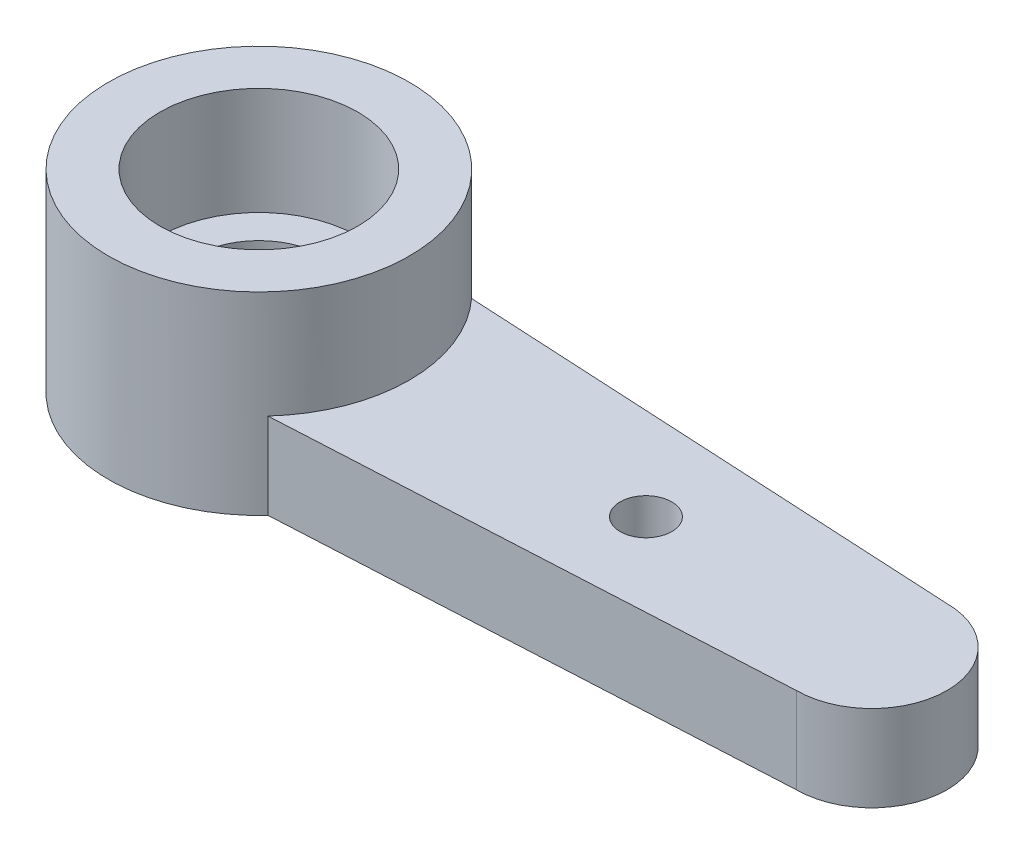
ISO-10303-21;
HEADER;
FILE_DESCRIPTION(('STEP AP214'),'2;1');
FILE_NAME('part.step','',(''),(''),'','','');
FILE_SCHEMA(('AUTOMOTIVE_DESIGN { 1 0 10303 214 1 1 1 1 }'));
ENDSEC;
DATA;
#1=APPLICATION_CONTEXT('core data for automotive mechanical design processes');
#2=APPLICATION_PROTOCOL_DEFINITION('international standard','automotive_design',2000,#1);
#3=PRODUCT_CONTEXT('',#1,'mechanical');
#4=PRODUCT('Part','Part','',(#3));
#5=PRODUCT_RELATED_PRODUCT_CATEGORY('part','',(#4));
#6=PRODUCT_DEFINITION_FORMATION('','',#4);
#7=PRODUCT_DEFINITION_CONTEXT('part definition',#1,'design');
#8=PRODUCT_DEFINITION('design','',#6,#7);
#9=PRODUCT_DEFINITION_SHAPE('','',#8);
#10=(LENGTH_UNIT() NAMED_UNIT(*) SI_UNIT(.MILLI.,.METRE.));
#11=(NAMED_UNIT(*) PLANE_ANGLE_UNIT() SI_UNIT($,.RADIAN.));
#12=(NAMED_UNIT(*) SI_UNIT($,.STERADIAN.) SOLID_ANGLE_UNIT());
#13=UNCERTAINTY_MEASURE_WITH_UNIT(LENGTH_MEASURE(1.E-05),#10,'distance_accuracy_value','');
#14=(GEOMETRIC_REPRESENTATION_CONTEXT(3) GLOBAL_UNCERTAINTY_ASSIGNED_CONTEXT((#13)) GLOBAL_UNIT_ASSIGNED_CONTEXT((#10,
#11,#12)) REPRESENTATION_CONTEXT('',''));
#15=CARTESIAN_POINT('',(0.,0.,0.));
#16=DIRECTION('',(0.,0.,1.));
#17=DIRECTION('',(1.,0.,0.));
#18=AXIS2_PLACEMENT_3D('',#15,#16,#17);
#19=CARTESIAN_POINT('',(0.,2.5,0.));
#20=DIRECTION('',(0.,-1.,0.));
#21=DIRECTION('',(0.,0.,-1.));
#22=AXIS2_PLACEMENT_3D('',#19,#20,#21);
#23=CYLINDRICAL_SURFACE('',#22,2.3);
#24=CARTESIAN_POINT('',(0.,-2.,0.));
#25=DIRECTION('',(0.,1.,0.));
#26=DIRECTION('',(0.,0.,1.));
#27=AXIS2_PLACEMENT_3D('',#24,#25,#26);
#28=CIRCLE('',#27,2.3);
#29=CARTESIAN_POINT('',(0.,-2.,2.3));
#30=VERTEX_POINT('',#29);
#31=EDGE_CURVE('E107',#30,#30,#28,.T.);
#32=ORIENTED_EDGE('',*,*,#31,.F.);
#33=EDGE_LOOP('',(#32));
#34=FACE_BOUND('',#33,.T.);
#35=CARTESIAN_POINT('',(0.,-1.,0.));
#36=DIRECTION('',(0.,1.,0.));
#37=DIRECTION('',(0.,0.,1.));
#38=AXIS2_PLACEMENT_3D('',#35,#36,#37);
#39=CIRCLE('',#38,2.3);
#40=CARTESIAN_POINT('',(0.,-1.,2.3));
#41=VERTEX_POINT('',#40);
#42=EDGE_CURVE('E103',#41,#41,#39,.T.);
#43=ORIENTED_EDGE('',*,*,#42,.T.);
#44=EDGE_LOOP('',(#43));
#45=FACE_BOUND('',#44,.T.);
#46=ADVANCED_FACE('F33',(#34,#45),#23,.F.);
#47=CARTESIAN_POINT('',(0.,0.,0.));
#48=DIRECTION('',(0.,1.,0.));
#49=DIRECTION('',(0.,0.,1.));
#50=AXIS2_PLACEMENT_3D('',#47,#48,#49);
#51=CIRCLE('',#50,2.3);
#52=CARTESIAN_POINT('',(0.,0.,2.3));
#53=VERTEX_POINT('',#52);
#54=EDGE_CURVE('E11',#53,#53,#51,.T.);
#55=ORIENTED_EDGE('',*,*,#54,.F.);
#56=EDGE_LOOP('',(#55));
#57=FACE_BOUND('',#56,.T.);
#58=CARTESIAN_POINT('',(0.,2.5,0.));
#59=DIRECTION('',(0.,1.,0.));
#60=DIRECTION('',(0.,0.,1.));
#61=AXIS2_PLACEMENT_3D('',#58,#59,#60);
#62=CIRCLE('',#61,2.3);
#63=CARTESIAN_POINT('',(0.,2.5,2.3));
#64=VERTEX_POINT('',#63);
#65=EDGE_CURVE('E112',#64,#64,#62,.T.);
#66=ORIENTED_EDGE('',*,*,#65,.T.);
#67=EDGE_LOOP('',(#66));
#68=FACE_BOUND('',#67,.T.);
#69=ADVANCED_FACE('F35',(#57,#68),#23,.F.);
#70=CARTESIAN_POINT('',(0.,2.5,0.));
#71=DIRECTION('',(0.,-1.,0.));
#72=DIRECTION('',(0.,0.,-1.));
#73=AXIS2_PLACEMENT_3D('',#70,#71,#72);
#74=CYLINDRICAL_SURFACE('',#73,3.5);
#75=CARTESIAN_POINT('',(0.,2.5,0.));
#76=DIRECTION('',(0.,1.,0.));
#77=DIRECTION('',(0.,0.,1.));
#78=AXIS2_PLACEMENT_3D('',#75,#76,#77);
#79=CIRCLE('',#78,3.5);
#80=CARTESIAN_POINT('',(0.,2.5,3.5));
#81=VERTEX_POINT('',#80);
#82=EDGE_CURVE('E41',#81,#81,#79,.T.);
#83=ORIENTED_EDGE('',*,*,#82,.F.);
#84=EDGE_LOOP('',(#83));
#85=FACE_BOUND('',#84,.T.);
#86=CARTESIAN_POINT('',(0.,0.,0.));
#87=DIRECTION('',(0.,1.,0.));
#88=DIRECTION('',(0.,0.,1.));
#89=AXIS2_PLACEMENT_3D('',#86,#87,#88);
#90=CIRCLE('',#89,3.5);
#91=CARTESIAN_POINT('',(2.57807984240258,0.,2.36717222149076));
#92=VERTEX_POINT('',#91);
#93=CARTESIAN_POINT('',(2.57807984240258,0.,-2.36717222149076));
#94=VERTEX_POINT('',#93);
#95=EDGE_CURVE('E109',#92,#94,#90,.T.);
#96=ORIENTED_EDGE('',*,*,#95,.T.);
#97=DIRECTION('',(0.,1.,0.));
#98=VECTOR('',#97,1.);
#99=CARTESIAN_POINT('',(2.57807984240258,-2.,-2.36717222149076));
#100=LINE('',#99,#98);
#101=CARTESIAN_POINT('',(2.57807984240258,-2.,-2.36717222149076));
#102=VERTEX_POINT('',#101);
#103=EDGE_CURVE('E57',#102,#94,#100,.T.);
#104=ORIENTED_EDGE('',*,*,#103,.F.);
#105=CARTESIAN_POINT('',(0.,-2.,0.));
#106=DIRECTION('',(0.,1.,0.));
#107=DIRECTION('',(0.,0.,1.));
#108=AXIS2_PLACEMENT_3D('',#105,#106,#107);
#109=CIRCLE('',#108,3.5);
#110=CARTESIAN_POINT('',(2.57807984240258,-2.,2.36717222149076));
#111=VERTEX_POINT('',#110);
#112=EDGE_CURVE('E94',#102,#111,#109,.T.);
#113=ORIENTED_EDGE('',*,*,#112,.T.);
#114=DIRECTION('',(0.,1.,0.));
#115=VECTOR('',#114,1.);
#116=CARTESIAN_POINT('',(2.57807984240258,-2.,2.36717222149076));
#117=LINE('',#116,#115);
#118=EDGE_CURVE('E91',#111,#92,#117,.T.);
#119=ORIENTED_EDGE('',*,*,#118,.T.);
#120=EDGE_LOOP('',(#96,#104,#113,#119));
#121=FACE_BOUND('',#120,.T.);
#122=ADVANCED_FACE('F117',(#85,#121),#74,.T.);
#123=CARTESIAN_POINT('',(0.,2.5,0.));
#124=DIRECTION('',(0.,1.,0.));
#125=DIRECTION('',(0.,0.,1.));
#126=AXIS2_PLACEMENT_3D('',#123,#124,#125);
#127=PLANE('',#126);
#128=ORIENTED_EDGE('',*,*,#65,.F.);
#129=EDGE_LOOP('',(#128));
#130=FACE_BOUND('',#129,.T.);
#131=ORIENTED_EDGE('',*,*,#82,.T.);
#132=EDGE_LOOP('',(#131));
#133=FACE_BOUND('',#132,.T.);
#134=ADVANCED_FACE('F129',(#130,#133),#127,.T.);
#135=CARTESIAN_POINT('',(0.,0.,0.));
#136=DIRECTION('',(0.,1.,0.));
#137=DIRECTION('',(0.,0.,1.));
#138=AXIS2_PLACEMENT_3D('',#135,#136,#137);
#139=PLANE('',#138);
#140=CARTESIAN_POINT('',(9.,0.,0.));
#141=DIRECTION('',(0.,1.,0.));
#142=DIRECTION('',(0.,0.,1.));
#143=AXIS2_PLACEMENT_3D('',#140,#141,#142);
#144=CIRCLE('',#143,0.6);
#145=CARTESIAN_POINT('',(9.,0.,0.6));
#146=VERTEX_POINT('',#145);
#147=EDGE_CURVE('E181',#146,#146,#144,.T.);
#148=ORIENTED_EDGE('',*,*,#147,.F.);
#149=EDGE_LOOP('',(#148));
#150=FACE_BOUND('',#149,.T.);
#151=ORIENTED_EDGE('',*,*,#95,.F.);
#152=DIRECTION('',(-0.998604953776987,0.,0.0528029004133527));
#153=VECTOR('',#152,1.);
#154=CARTESIAN_POINT('',(0.132007251033382,0.,2.49651238444247));
#155=LINE('',#154,#153);
#156=CARTESIAN_POINT('',(14.25,0.,1.75));
#157=VERTEX_POINT('',#156);
#158=EDGE_CURVE('E48',#157,#92,#155,.T.);
#159=ORIENTED_EDGE('',*,*,#158,.F.);
#160=CARTESIAN_POINT('',(14.25,0.,0.));
#161=DIRECTION('',(0.,1.,0.));
#162=DIRECTION('',(0.,0.,1.));
#163=AXIS2_PLACEMENT_3D('',#160,#161,#162);
#164=CIRCLE('',#163,1.75);
#165=CARTESIAN_POINT('',(14.25,0.,-1.75));
#166=VERTEX_POINT('',#165);
#167=EDGE_CURVE('E89',#157,#166,#164,.T.);
#168=ORIENTED_EDGE('',*,*,#167,.T.);
#169=DIRECTION('',(-0.998604953776987,0.,-0.0528029004133526));
#170=VECTOR('',#169,1.);
#171=CARTESIAN_POINT('',(0.132007251033382,0.,-2.49651238444247));
#172=LINE('',#171,#170);
#173=EDGE_CURVE('E105',#166,#94,#172,.T.);
#174=ORIENTED_EDGE('',*,*,#173,.T.);
#175=EDGE_LOOP('',(#151,#159,#168,#174));
#176=FACE_BOUND('',#175,.T.);
#177=ADVANCED_FACE('F119',(#150,#176),#139,.T.);
#178=CARTESIAN_POINT('',(0.132007251033382,-2.,-2.49651238444247));
#179=DIRECTION('',(0.0528029004133526,0.,-0.998604953776987));
#180=DIRECTION('',(-0.998604953776987,0.,-0.0528029004133526));
#181=AXIS2_PLACEMENT_3D('',#178,#179,#180);
#182=PLANE('',#181);
#183=ORIENTED_EDGE('',*,*,#173,.F.);
#184=DIRECTION('',(0.,1.,0.));
#185=VECTOR('',#184,1.);
#186=CARTESIAN_POINT('',(14.25,-2.,-1.75));
#187=LINE('',#186,#185);
#188=CARTESIAN_POINT('',(14.25,-2.,-1.75));
#189=VERTEX_POINT('',#188);
#190=EDGE_CURVE('E90',#189,#166,#187,.T.);
#191=ORIENTED_EDGE('',*,*,#190,.F.);
#192=DIRECTION('',(-0.998604953776987,0.,-0.0528029004133526));
#193=VECTOR('',#192,1.);
#194=CARTESIAN_POINT('',(0.132007251033382,-2.,-2.49651238444247));
#195=LINE('',#194,#193);
#196=EDGE_CURVE('E97',#189,#102,#195,.T.);
#197=ORIENTED_EDGE('',*,*,#196,.T.);
#198=ORIENTED_EDGE('',*,*,#103,.T.);
#199=EDGE_LOOP('',(#183,#191,#197,#198));
#200=FACE_BOUND('',#199,.T.);
#201=ADVANCED_FACE('F120',(#200),#182,.T.);
#202=CARTESIAN_POINT('',(14.25,-2.,0.));
#203=DIRECTION('',(0.,1.,0.));
#204=DIRECTION('',(0.,0.,1.));
#205=AXIS2_PLACEMENT_3D('',#202,#203,#204);
#206=CYLINDRICAL_SURFACE('',#205,1.75);
#207=ORIENTED_EDGE('',*,*,#167,.F.);
#208=DIRECTION('',(0.,1.,0.));
#209=VECTOR('',#208,1.);
#210=CARTESIAN_POINT('',(14.25,-2.,1.75));
#211=LINE('',#210,#209);
#212=CARTESIAN_POINT('',(14.25,-2.,1.75));
#213=VERTEX_POINT('',#212);
#214=EDGE_CURVE('E84',#213,#157,#211,.T.);
#215=ORIENTED_EDGE('',*,*,#214,.F.);
#216=CARTESIAN_POINT('',(14.25,-2.,0.));
#217=DIRECTION('',(0.,1.,0.));
#218=DIRECTION('',(0.,0.,1.));
#219=AXIS2_PLACEMENT_3D('',#216,#217,#218);
#220=CIRCLE('',#219,1.75);
#221=EDGE_CURVE('E86',#213,#189,#220,.T.);
#222=ORIENTED_EDGE('',*,*,#221,.T.);
#223=ORIENTED_EDGE('',*,*,#190,.T.);
#224=EDGE_LOOP('',(#207,#215,#222,#223));
#225=FACE_BOUND('',#224,.T.);
#226=ADVANCED_FACE('F85',(#225),#206,.T.);
#227=CARTESIAN_POINT('',(0.132007251033382,-2.,2.49651238444247));
#228=DIRECTION('',(-0.0528029004133527,0.,-0.998604953776987));
#229=DIRECTION('',(-0.998604953776987,0.,0.0528029004133527));
#230=AXIS2_PLACEMENT_3D('',#227,#228,#229);
#231=PLANE('',#230);
#232=ORIENTED_EDGE('',*,*,#158,.T.);
#233=ORIENTED_EDGE('',*,*,#118,.F.);
#234=DIRECTION('',(-0.998604953776987,0.,0.0528029004133527));
#235=VECTOR('',#234,1.);
#236=CARTESIAN_POINT('',(0.132007251033382,-2.,2.49651238444247));
#237=LINE('',#236,#235);
#238=EDGE_CURVE('E79',#213,#111,#237,.T.);
#239=ORIENTED_EDGE('',*,*,#238,.F.);
#240=ORIENTED_EDGE('',*,*,#214,.T.);
#241=EDGE_LOOP('',(#232,#233,#239,#240));
#242=FACE_BOUND('',#241,.T.);
#243=ADVANCED_FACE('F93',(#242),#231,.F.);
#244=CARTESIAN_POINT('',(0.,-2.,0.));
#245=DIRECTION('',(0.,1.,0.));
#246=DIRECTION('',(0.,0.,1.));
#247=AXIS2_PLACEMENT_3D('',#244,#245,#246);
#248=PLANE('',#247);
#249=CARTESIAN_POINT('',(9.,-2.,0.));
#250=DIRECTION('',(0.,-1.,0.));
#251=DIRECTION('',(0.,0.,-1.));
#252=AXIS2_PLACEMENT_3D('',#249,#250,#251);
#253=CIRCLE('',#252,0.6);
#254=CARTESIAN_POINT('',(9.,-2.,-0.6));
#255=VERTEX_POINT('',#254);
#256=EDGE_CURVE('E183',#255,#255,#253,.T.);
#257=ORIENTED_EDGE('',*,*,#256,.F.);
#258=EDGE_LOOP('',(#257));
#259=FACE_BOUND('',#258,.T.);
#260=ORIENTED_EDGE('',*,*,#31,.T.);
#261=EDGE_LOOP('',(#260));
#262=FACE_BOUND('',#261,.T.);
#263=ORIENTED_EDGE('',*,*,#112,.F.);
#264=ORIENTED_EDGE('',*,*,#196,.F.);
#265=ORIENTED_EDGE('',*,*,#221,.F.);
#266=ORIENTED_EDGE('',*,*,#238,.T.);
#267=EDGE_LOOP('',(#263,#264,#265,#266));
#268=FACE_BOUND('',#267,.T.);
#269=ADVANCED_FACE('F96',(#259,#262,#268),#248,.F.);
#270=CARTESIAN_POINT('',(0.,-1.,0.));
#271=DIRECTION('',(0.,1.,0.));
#272=DIRECTION('',(0.,0.,1.));
#273=AXIS2_PLACEMENT_3D('',#270,#271,#272);
#274=PLANE('',#273);
#275=CARTESIAN_POINT('',(0.,-1.,0.));
#276=DIRECTION('',(0.,1.,0.));
#277=DIRECTION('',(0.,0.,1.));
#278=AXIS2_PLACEMENT_3D('',#275,#276,#277);
#279=CIRCLE('',#278,1.5);
#280=CARTESIAN_POINT('',(0.,-1.,1.5));
#281=VERTEX_POINT('',#280);
#282=EDGE_CURVE('E144',#281,#281,#279,.T.);
#283=ORIENTED_EDGE('',*,*,#282,.T.);
#284=EDGE_LOOP('',(#283));
#285=FACE_BOUND('',#284,.T.);
#286=ORIENTED_EDGE('',*,*,#42,.F.);
#287=EDGE_LOOP('',(#286));
#288=FACE_BOUND('',#287,.T.);
#289=ADVANCED_FACE('F153',(#285,#288),#274,.F.);
#290=CARTESIAN_POINT('',(0.,0.,0.));
#291=DIRECTION('',(0.,1.,0.));
#292=DIRECTION('',(0.,0.,1.));
#293=AXIS2_PLACEMENT_3D('',#290,#291,#292);
#294=PLANE('',#293);
#295=CARTESIAN_POINT('',(0.,0.,0.));
#296=DIRECTION('',(0.,1.,0.));
#297=DIRECTION('',(0.,0.,1.));
#298=AXIS2_PLACEMENT_3D('',#295,#296,#297);
#299=CIRCLE('',#298,1.5);
#300=CARTESIAN_POINT('',(0.,0.,1.5));
#301=VERTEX_POINT('',#300);
#302=EDGE_CURVE('E147',#301,#301,#299,.T.);
#303=ORIENTED_EDGE('',*,*,#302,.F.);
#304=EDGE_LOOP('',(#303));
#305=FACE_BOUND('',#304,.T.);
#306=ORIENTED_EDGE('',*,*,#54,.T.);
#307=EDGE_LOOP('',(#306));
#308=FACE_BOUND('',#307,.T.);
#309=ADVANCED_FACE('F160',(#305,#308),#294,.T.);
#310=CARTESIAN_POINT('',(0.,-1.,0.));
#311=DIRECTION('',(0.,1.,0.));
#312=DIRECTION('',(0.,0.,1.));
#313=AXIS2_PLACEMENT_3D('',#310,#311,#312);
#314=CYLINDRICAL_SURFACE('',#313,1.5);
#315=ORIENTED_EDGE('',*,*,#282,.F.);
#316=EDGE_LOOP('',(#315));
#317=FACE_BOUND('',#316,.T.);
#318=ORIENTED_EDGE('',*,*,#302,.T.);
#319=EDGE_LOOP('',(#318));
#320=FACE_BOUND('',#319,.T.);
#321=ADVANCED_FACE('F168',(#317,#320),#314,.F.);
#322=CARTESIAN_POINT('',(9.,8.,0.));
#323=DIRECTION('',(0.,-1.,0.));
#324=DIRECTION('',(0.,0.,-1.));
#325=AXIS2_PLACEMENT_3D('',#322,#323,#324);
#326=CYLINDRICAL_SURFACE('',#325,0.6);
#327=ORIENTED_EDGE('',*,*,#147,.T.);
#328=EDGE_LOOP('',(#327));
#329=FACE_BOUND('',#328,.T.);
#330=ORIENTED_EDGE('',*,*,#256,.T.);
#331=EDGE_LOOP('',(#330));
#332=FACE_BOUND('',#331,.T.);
#333=ADVANCED_FACE('F173',(#329,#332),#326,.F.);
#334=CLOSED_SHELL('',(#46,#69,#122,#134,#177,#201,#226,#243,#269,#289,#309,#321,#333));
#335=MANIFOLD_SOLID_BREP('B2',#334);
#336=ADVANCED_BREP_SHAPE_REPRESENTATION('',(#18,#335),#14);
#337=SHAPE_DEFINITION_REPRESENTATION(#9,#336);
ENDSEC;
END-ISO-10303-21;
